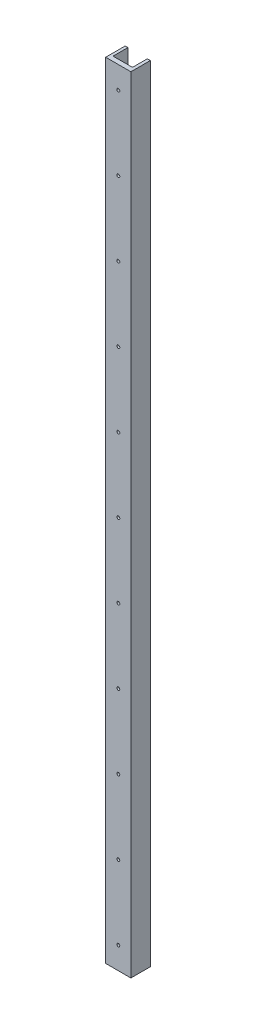
ISO-10303-21;
HEADER;
FILE_DESCRIPTION(('STEP AP214'),'2;1');
FILE_NAME('part.step','',(''),(''),'','','');
FILE_SCHEMA(('AUTOMOTIVE_DESIGN { 1 0 10303 214 1 1 1 1 }'));
ENDSEC;
DATA;
#1=APPLICATION_CONTEXT('core data for automotive mechanical design processes');
#2=APPLICATION_PROTOCOL_DEFINITION('international standard','automotive_design',2000,#1);
#3=PRODUCT_CONTEXT('',#1,'mechanical');
#4=PRODUCT('Part','Part','',(#3));
#5=PRODUCT_RELATED_PRODUCT_CATEGORY('part','',(#4));
#6=PRODUCT_DEFINITION_FORMATION('','',#4);
#7=PRODUCT_DEFINITION_CONTEXT('part definition',#1,'design');
#8=PRODUCT_DEFINITION('design','',#6,#7);
#9=PRODUCT_DEFINITION_SHAPE('','',#8);
#10=(LENGTH_UNIT() NAMED_UNIT(*) SI_UNIT(.MILLI.,.METRE.));
#11=(NAMED_UNIT(*) PLANE_ANGLE_UNIT() SI_UNIT($,.RADIAN.));
#12=(NAMED_UNIT(*) SI_UNIT($,.STERADIAN.) SOLID_ANGLE_UNIT());
#13=UNCERTAINTY_MEASURE_WITH_UNIT(LENGTH_MEASURE(1.E-05),#10,'distance_accuracy_value','');
#14=(GEOMETRIC_REPRESENTATION_CONTEXT(3) GLOBAL_UNCERTAINTY_ASSIGNED_CONTEXT((#13)) GLOBAL_UNIT_ASSIGNED_CONTEXT((#10,
#11,#12)) REPRESENTATION_CONTEXT('',''));
#15=CARTESIAN_POINT('',(0.,0.,0.));
#16=DIRECTION('',(0.,0.,1.));
#17=DIRECTION('',(1.,0.,0.));
#18=AXIS2_PLACEMENT_3D('',#15,#16,#17);
#19=CARTESIAN_POINT('',(0.,0.,0.));
#20=DIRECTION('',(0.,0.,-1.));
#21=DIRECTION('',(-1.,0.,0.));
#22=AXIS2_PLACEMENT_3D('',#19,#20,#21);
#23=PLANE('',#22);
#24=DIRECTION('',(1.,0.,0.));
#25=VECTOR('',#24,1.);
#26=CARTESIAN_POINT('',(-43.18,-1221.28003368592,0.));
#27=LINE('',#26,#25);
#28=CARTESIAN_POINT('',(-5.1435,-1221.28003368592,0.));
#29=VERTEX_POINT('',#28);
#30=CARTESIAN_POINT('',(0.,-1221.28003368592,0.));
#31=VERTEX_POINT('',#30);
#32=EDGE_CURVE('E153',#29,#31,#27,.T.);
#33=ORIENTED_EDGE('',*,*,#32,.F.);
#34=DIRECTION('',(0.,1.,0.));
#35=VECTOR('',#34,1.);
#36=CARTESIAN_POINT('',(-5.1435,0.,0.));
#37=LINE('',#36,#35);
#38=CARTESIAN_POINT('',(-5.1435,124.919966314081,0.));
#39=VERTEX_POINT('',#38);
#40=EDGE_CURVE('E42',#29,#39,#37,.T.);
#41=ORIENTED_EDGE('',*,*,#40,.T.);
#42=DIRECTION('',(-1.,0.,0.));
#43=VECTOR('',#42,1.);
#44=CARTESIAN_POINT('',(-43.18,124.919966314081,0.));
#45=LINE('',#44,#43);
#46=CARTESIAN_POINT('',(0.,124.919966314081,0.));
#47=VERTEX_POINT('',#46);
#48=EDGE_CURVE('E145',#47,#39,#45,.T.);
#49=ORIENTED_EDGE('',*,*,#48,.F.);
#50=DIRECTION('',(0.,1.,0.));
#51=VECTOR('',#50,1.);
#52=CARTESIAN_POINT('',(0.,-1221.28003368592,0.));
#53=LINE('',#52,#51);
#54=EDGE_CURVE('E155',#31,#47,#53,.T.);
#55=ORIENTED_EDGE('',*,*,#54,.F.);
#56=EDGE_LOOP('',(#33,#41,#49,#55));
#57=FACE_BOUND('',#56,.T.);
#58=ADVANCED_FACE('F33',(#57),#23,.T.);
#59=CARTESIAN_POINT('',(-43.18,-1221.28003368592,33.3248));
#60=DIRECTION('',(1.,0.,0.));
#61=DIRECTION('',(0.,0.,-1.));
#62=AXIS2_PLACEMENT_3D('',#59,#60,#61);
#63=PLANE('',#62);
#64=DIRECTION('',(0.,-1.,0.));
#65=VECTOR('',#64,1.);
#66=CARTESIAN_POINT('',(-43.18,-1221.28003368592,0.));
#67=LINE('',#66,#65);
#68=CARTESIAN_POINT('',(-43.18,124.919966314081,0.));
#69=VERTEX_POINT('',#68);
#70=CARTESIAN_POINT('',(-43.18,-1221.28003368592,0.));
#71=VERTEX_POINT('',#70);
#72=EDGE_CURVE('E141',#69,#71,#67,.T.);
#73=ORIENTED_EDGE('',*,*,#72,.T.);
#74=DIRECTION('',(0.,0.,-1.));
#75=VECTOR('',#74,1.);
#76=CARTESIAN_POINT('',(-43.18,-1221.28003368592,33.3248));
#77=LINE('',#76,#75);
#78=CARTESIAN_POINT('',(-43.18,-1221.28003368592,33.3248));
#79=VERTEX_POINT('',#78);
#80=EDGE_CURVE('E166',#79,#71,#77,.T.);
#81=ORIENTED_EDGE('',*,*,#80,.F.);
#82=DIRECTION('',(0.,-1.,0.));
#83=VECTOR('',#82,1.);
#84=CARTESIAN_POINT('',(-43.18,-1221.28003368592,33.3248));
#85=LINE('',#84,#83);
#86=CARTESIAN_POINT('',(-43.18,124.919966314081,33.3248));
#87=VERTEX_POINT('',#86);
#88=EDGE_CURVE('E143',#87,#79,#85,.T.);
#89=ORIENTED_EDGE('',*,*,#88,.F.);
#90=DIRECTION('',(0.,0.,-1.));
#91=VECTOR('',#90,1.);
#92=CARTESIAN_POINT('',(-43.18,124.919966314081,33.3248));
#93=LINE('',#92,#91);
#94=EDGE_CURVE('E150',#87,#69,#93,.T.);
#95=ORIENTED_EDGE('',*,*,#94,.T.);
#96=EDGE_LOOP('',(#73,#81,#89,#95));
#97=FACE_BOUND('',#96,.T.);
#98=ADVANCED_FACE('F35',(#97),#63,.F.);
#99=CARTESIAN_POINT('',(-43.18,-1221.28003368592,33.3248));
#100=DIRECTION('',(0.,1.,0.));
#101=DIRECTION('',(0.,0.,1.));
#102=AXIS2_PLACEMENT_3D('',#99,#100,#101);
#103=PLANE('',#102);
#104=CARTESIAN_POINT('',(-38.481,-1221.28003368592,0.));
#105=VERTEX_POINT('',#104);
#106=EDGE_CURVE('E129',#71,#105,#27,.T.);
#107=ORIENTED_EDGE('',*,*,#106,.T.);
#108=DIRECTION('',(0.,0.,1.));
#109=VECTOR('',#108,1.);
#110=CARTESIAN_POINT('',(-38.481,-1221.28003368592,-7.73428244373345));
#111=LINE('',#110,#109);
#112=CARTESIAN_POINT('',(-38.481,-1221.28003368592,25.3873));
#113=VERTEX_POINT('',#112);
#114=EDGE_CURVE('E112',#105,#113,#111,.T.);
#115=ORIENTED_EDGE('',*,*,#114,.T.);
#116=DIRECTION('',(1.,0.,0.));
#117=VECTOR('',#116,1.);
#118=CARTESIAN_POINT('',(-38.481,-1221.28003368592,25.3873));
#119=LINE('',#118,#117);
#120=CARTESIAN_POINT('',(-5.1435,-1221.28003368592,25.3873));
#121=VERTEX_POINT('',#120);
#122=EDGE_CURVE('E123',#113,#121,#119,.T.);
#123=ORIENTED_EDGE('',*,*,#122,.T.);
#124=DIRECTION('',(0.,0.,1.));
#125=VECTOR('',#124,1.);
#126=CARTESIAN_POINT('',(-5.1435,-1221.28003368592,-7.73428244373345));
#127=LINE('',#126,#125);
#128=EDGE_CURVE('E119',#29,#121,#127,.T.);
#129=ORIENTED_EDGE('',*,*,#128,.F.);
#130=ORIENTED_EDGE('',*,*,#32,.T.);
#131=DIRECTION('',(0.,0.,-1.));
#132=VECTOR('',#131,1.);
#133=CARTESIAN_POINT('',(0.,-1221.28003368592,33.3248));
#134=LINE('',#133,#132);
#135=CARTESIAN_POINT('',(0.,-1221.28003368592,33.3248));
#136=VERTEX_POINT('',#135);
#137=EDGE_CURVE('E163',#136,#31,#134,.T.);
#138=ORIENTED_EDGE('',*,*,#137,.F.);
#139=DIRECTION('',(1.,0.,0.));
#140=VECTOR('',#139,1.);
#141=CARTESIAN_POINT('',(-43.18,-1221.28003368592,33.3248));
#142=LINE('',#141,#140);
#143=EDGE_CURVE('E88',#79,#136,#142,.T.);
#144=ORIENTED_EDGE('',*,*,#143,.F.);
#145=ORIENTED_EDGE('',*,*,#80,.T.);
#146=EDGE_LOOP('',(#107,#115,#123,#129,#130,#138,#144,#145));
#147=FACE_BOUND('',#146,.T.);
#148=ADVANCED_FACE('F128',(#147),#103,.F.);
#149=CARTESIAN_POINT('',(0.,-1221.28003368592,33.3248));
#150=DIRECTION('',(-1.,0.,0.));
#151=DIRECTION('',(0.,0.,1.));
#152=AXIS2_PLACEMENT_3D('',#149,#150,#151);
#153=PLANE('',#152);
#154=ORIENTED_EDGE('',*,*,#54,.T.);
#155=DIRECTION('',(0.,0.,-1.));
#156=VECTOR('',#155,1.);
#157=CARTESIAN_POINT('',(0.,124.919966314081,33.3248));
#158=LINE('',#157,#156);
#159=CARTESIAN_POINT('',(0.,124.919966314081,33.3248));
#160=VERTEX_POINT('',#159);
#161=EDGE_CURVE('E160',#160,#47,#158,.T.);
#162=ORIENTED_EDGE('',*,*,#161,.F.);
#163=DIRECTION('',(0.,1.,0.));
#164=VECTOR('',#163,1.);
#165=CARTESIAN_POINT('',(0.,-1221.28003368592,33.3248));
#166=LINE('',#165,#164);
#167=EDGE_CURVE('E147',#136,#160,#166,.T.);
#168=ORIENTED_EDGE('',*,*,#167,.F.);
#169=ORIENTED_EDGE('',*,*,#137,.T.);
#170=EDGE_LOOP('',(#154,#162,#168,#169));
#171=FACE_BOUND('',#170,.T.);
#172=ADVANCED_FACE('F305',(#171),#153,.F.);
#173=CARTESIAN_POINT('',(-43.18,124.919966314081,33.3248));
#174=DIRECTION('',(0.,-1.,0.));
#175=DIRECTION('',(0.,0.,-1.));
#176=AXIS2_PLACEMENT_3D('',#173,#174,#175);
#177=PLANE('',#176);
#178=DIRECTION('',(1.,0.,0.));
#179=VECTOR('',#178,1.);
#180=CARTESIAN_POINT('',(-38.481,124.919966314081,25.3873));
#181=LINE('',#180,#179);
#182=CARTESIAN_POINT('',(-38.481,124.919966314081,25.3873));
#183=VERTEX_POINT('',#182);
#184=CARTESIAN_POINT('',(-5.1435,124.919966314081,25.3873));
#185=VERTEX_POINT('',#184);
#186=EDGE_CURVE('E131',#183,#185,#181,.T.);
#187=ORIENTED_EDGE('',*,*,#186,.F.);
#188=DIRECTION('',(0.,0.,1.));
#189=VECTOR('',#188,1.);
#190=CARTESIAN_POINT('',(-38.481,124.919966314081,-7.73428244373345));
#191=LINE('',#190,#189);
#192=CARTESIAN_POINT('',(-38.481,124.919966314081,0.));
#193=VERTEX_POINT('',#192);
#194=EDGE_CURVE('E114',#193,#183,#191,.T.);
#195=ORIENTED_EDGE('',*,*,#194,.F.);
#196=EDGE_CURVE('E80',#193,#69,#45,.T.);
#197=ORIENTED_EDGE('',*,*,#196,.T.);
#198=ORIENTED_EDGE('',*,*,#94,.F.);
#199=DIRECTION('',(-1.,0.,0.));
#200=VECTOR('',#199,1.);
#201=CARTESIAN_POINT('',(-43.18,124.919966314081,33.3248));
#202=LINE('',#201,#200);
#203=EDGE_CURVE('E59',#160,#87,#202,.T.);
#204=ORIENTED_EDGE('',*,*,#203,.F.);
#205=ORIENTED_EDGE('',*,*,#161,.T.);
#206=ORIENTED_EDGE('',*,*,#48,.T.);
#207=DIRECTION('',(0.,0.,1.));
#208=VECTOR('',#207,1.);
#209=CARTESIAN_POINT('',(-5.1435,124.919966314081,-7.73428244373345));
#210=LINE('',#209,#208);
#211=EDGE_CURVE('E50',#39,#185,#210,.T.);
#212=ORIENTED_EDGE('',*,*,#211,.T.);
#213=EDGE_LOOP('',(#187,#195,#197,#198,#204,#205,#206,#212));
#214=FACE_BOUND('',#213,.T.);
#215=ADVANCED_FACE('F297',(#214),#177,.F.);
#216=CARTESIAN_POINT('',(0.,0.,33.3248));
#217=DIRECTION('',(0.,0.,-1.));
#218=DIRECTION('',(-1.,0.,0.));
#219=AXIS2_PLACEMENT_3D('',#216,#217,#218);
#220=PLANE('',#219);
#221=CARTESIAN_POINT('',(-21.59,-1183.18003368592,33.3248));
#222=DIRECTION('',(0.,0.,-1.));
#223=DIRECTION('',(-1.,0.,0.));
#224=AXIS2_PLACEMENT_3D('',#221,#222,#223);
#225=CIRCLE('',#224,2.55269999999998);
#226=CARTESIAN_POINT('',(-24.1427,-1183.18003368592,33.3248));
#227=VERTEX_POINT('',#226);
#228=EDGE_CURVE('E37',#227,#227,#225,.T.);
#229=ORIENTED_EDGE('',*,*,#228,.T.);
#230=EDGE_LOOP('',(#229));
#231=FACE_BOUND('',#230,.T.);
#232=CARTESIAN_POINT('',(-21.5900000000004,-1056.18003368592,33.3248));
#233=DIRECTION('',(0.,0.,-1.));
#234=DIRECTION('',(-1.,0.,0.));
#235=AXIS2_PLACEMENT_3D('',#232,#233,#234);
#236=CIRCLE('',#235,2.55269999999998);
#237=CARTESIAN_POINT('',(-24.1427000000004,-1056.18003368592,33.3248));
#238=VERTEX_POINT('',#237);
#239=EDGE_CURVE('E210',#238,#238,#236,.T.);
#240=ORIENTED_EDGE('',*,*,#239,.T.);
#241=EDGE_LOOP('',(#240));
#242=FACE_BOUND('',#241,.T.);
#243=CARTESIAN_POINT('',(-21.5900000000009,-929.180033685919,33.3248));
#244=DIRECTION('',(0.,0.,-1.));
#245=DIRECTION('',(-1.,0.,0.));
#246=AXIS2_PLACEMENT_3D('',#243,#244,#245);
#247=CIRCLE('',#246,2.55269999999998);
#248=CARTESIAN_POINT('',(-24.1427000000009,-929.180033685919,33.3248));
#249=VERTEX_POINT('',#248);
#250=EDGE_CURVE('E206',#249,#249,#247,.T.);
#251=ORIENTED_EDGE('',*,*,#250,.T.);
#252=EDGE_LOOP('',(#251));
#253=FACE_BOUND('',#252,.T.);
#254=CARTESIAN_POINT('',(-21.5900000000013,-802.180033685919,33.3248));
#255=DIRECTION('',(0.,0.,-1.));
#256=DIRECTION('',(-1.,0.,0.));
#257=AXIS2_PLACEMENT_3D('',#254,#255,#256);
#258=CIRCLE('',#257,2.55269999999998);
#259=CARTESIAN_POINT('',(-24.1427000000013,-802.180033685919,33.3248));
#260=VERTEX_POINT('',#259);
#261=EDGE_CURVE('E201',#260,#260,#258,.T.);
#262=ORIENTED_EDGE('',*,*,#261,.T.);
#263=EDGE_LOOP('',(#262));
#264=FACE_BOUND('',#263,.T.);
#265=CARTESIAN_POINT('',(-21.5900000000018,-675.180033685919,33.3248));
#266=DIRECTION('',(0.,0.,-1.));
#267=DIRECTION('',(-1.,0.,0.));
#268=AXIS2_PLACEMENT_3D('',#265,#266,#267);
#269=CIRCLE('',#268,2.55269999999998);
#270=CARTESIAN_POINT('',(-24.1427000000018,-675.180033685919,33.3248));
#271=VERTEX_POINT('',#270);
#272=EDGE_CURVE('E196',#271,#271,#269,.T.);
#273=ORIENTED_EDGE('',*,*,#272,.T.);
#274=EDGE_LOOP('',(#273));
#275=FACE_BOUND('',#274,.T.);
#276=CARTESIAN_POINT('',(-21.5900000000022,-548.180033685919,33.3248));
#277=DIRECTION('',(0.,0.,-1.));
#278=DIRECTION('',(-1.,0.,0.));
#279=AXIS2_PLACEMENT_3D('',#276,#277,#278);
#280=CIRCLE('',#279,2.55269999999998);
#281=CARTESIAN_POINT('',(-24.1427000000022,-548.180033685919,33.3248));
#282=VERTEX_POINT('',#281);
#283=EDGE_CURVE('E191',#282,#282,#280,.T.);
#284=ORIENTED_EDGE('',*,*,#283,.T.);
#285=EDGE_LOOP('',(#284));
#286=FACE_BOUND('',#285,.T.);
#287=CARTESIAN_POINT('',(-21.5900000000027,-421.180033685919,33.3248));
#288=DIRECTION('',(0.,0.,-1.));
#289=DIRECTION('',(-1.,0.,0.));
#290=AXIS2_PLACEMENT_3D('',#287,#288,#289);
#291=CIRCLE('',#290,2.55269999999998);
#292=CARTESIAN_POINT('',(-24.1427000000026,-421.180033685919,33.3248));
#293=VERTEX_POINT('',#292);
#294=EDGE_CURVE('E186',#293,#293,#291,.T.);
#295=ORIENTED_EDGE('',*,*,#294,.T.);
#296=EDGE_LOOP('',(#295));
#297=FACE_BOUND('',#296,.T.);
#298=CARTESIAN_POINT('',(-21.5900000000031,-294.180033685919,33.3248));
#299=DIRECTION('',(0.,0.,-1.));
#300=DIRECTION('',(-1.,0.,0.));
#301=AXIS2_PLACEMENT_3D('',#298,#299,#300);
#302=CIRCLE('',#301,2.55269999999998);
#303=CARTESIAN_POINT('',(-24.1427000000031,-294.180033685919,33.3248));
#304=VERTEX_POINT('',#303);
#305=EDGE_CURVE('E181',#304,#304,#302,.T.);
#306=ORIENTED_EDGE('',*,*,#305,.T.);
#307=EDGE_LOOP('',(#306));
#308=FACE_BOUND('',#307,.T.);
#309=CARTESIAN_POINT('',(-21.5900000000035,-167.180033685919,33.3248));
#310=DIRECTION('',(0.,0.,-1.));
#311=DIRECTION('',(-1.,0.,0.));
#312=AXIS2_PLACEMENT_3D('',#309,#310,#311);
#313=CIRCLE('',#312,2.55269999999998);
#314=CARTESIAN_POINT('',(-24.1427000000035,-167.180033685919,33.3248));
#315=VERTEX_POINT('',#314);
#316=EDGE_CURVE('E176',#315,#315,#313,.T.);
#317=ORIENTED_EDGE('',*,*,#316,.T.);
#318=EDGE_LOOP('',(#317));
#319=FACE_BOUND('',#318,.T.);
#320=CARTESIAN_POINT('',(-21.590000000004,-40.1800336859193,33.3248));
#321=DIRECTION('',(0.,0.,-1.));
#322=DIRECTION('',(-1.,0.,0.));
#323=AXIS2_PLACEMENT_3D('',#320,#321,#322);
#324=CIRCLE('',#323,2.55269999999998);
#325=CARTESIAN_POINT('',(-24.142700000004,-40.1800336859193,33.3248));
#326=VERTEX_POINT('',#325);
#327=EDGE_CURVE('E171',#326,#326,#324,.T.);
#328=ORIENTED_EDGE('',*,*,#327,.T.);
#329=EDGE_LOOP('',(#328));
#330=FACE_BOUND('',#329,.T.);
#331=CARTESIAN_POINT('',(-21.5900000000044,86.8199663140807,33.3248));
#332=DIRECTION('',(0.,0.,-1.));
#333=DIRECTION('',(-1.,0.,0.));
#334=AXIS2_PLACEMENT_3D('',#331,#332,#333);
#335=CIRCLE('',#334,2.55269999999998);
#336=CARTESIAN_POINT('',(-24.1427000000044,86.8199663140807,33.3248));
#337=VERTEX_POINT('',#336);
#338=EDGE_CURVE('E139',#337,#337,#335,.T.);
#339=ORIENTED_EDGE('',*,*,#338,.T.);
#340=EDGE_LOOP('',(#339));
#341=FACE_BOUND('',#340,.T.);
#342=ORIENTED_EDGE('',*,*,#88,.T.);
#343=ORIENTED_EDGE('',*,*,#143,.T.);
#344=ORIENTED_EDGE('',*,*,#167,.T.);
#345=ORIENTED_EDGE('',*,*,#203,.T.);
#346=EDGE_LOOP('',(#342,#343,#344,#345));
#347=FACE_BOUND('',#346,.T.);
#348=ADVANCED_FACE('F289',(#231,#242,#253,#264,#275,#286,#297,#308,#319,#330,#341,#347),#220,.F.);
#349=DIRECTION('',(0.,1.,0.));
#350=VECTOR('',#349,1.);
#351=CARTESIAN_POINT('',(-38.481,0.,0.));
#352=LINE('',#351,#350);
#353=EDGE_CURVE('E11',#105,#193,#352,.T.);
#354=ORIENTED_EDGE('',*,*,#353,.F.);
#355=ORIENTED_EDGE('',*,*,#106,.F.);
#356=ORIENTED_EDGE('',*,*,#72,.F.);
#357=ORIENTED_EDGE('',*,*,#196,.F.);
#358=EDGE_LOOP('',(#354,#355,#356,#357));
#359=FACE_BOUND('',#358,.T.);
#360=ADVANCED_FACE('F280',(#359),#23,.T.);
#361=CARTESIAN_POINT('',(-38.481,-1221.28003368592,-7.73428244373345));
#362=DIRECTION('',(-1.,0.,0.));
#363=DIRECTION('',(0.,0.,1.));
#364=AXIS2_PLACEMENT_3D('',#361,#362,#363);
#365=PLANE('',#364);
#366=ORIENTED_EDGE('',*,*,#353,.T.);
#367=ORIENTED_EDGE('',*,*,#194,.T.);
#368=DIRECTION('',(0.,1.,0.));
#369=VECTOR('',#368,1.);
#370=CARTESIAN_POINT('',(-38.481,-1221.28003368592,25.3873));
#371=LINE('',#370,#369);
#372=EDGE_CURVE('E108',#113,#183,#371,.T.);
#373=ORIENTED_EDGE('',*,*,#372,.F.);
#374=ORIENTED_EDGE('',*,*,#114,.F.);
#375=EDGE_LOOP('',(#366,#367,#373,#374));
#376=FACE_BOUND('',#375,.T.);
#377=ADVANCED_FACE('F110',(#376),#365,.F.);
#378=CARTESIAN_POINT('',(-5.1435,-1221.28003368592,-7.73428244373345));
#379=DIRECTION('',(-1.,0.,0.));
#380=DIRECTION('',(0.,0.,1.));
#381=AXIS2_PLACEMENT_3D('',#378,#379,#380);
#382=PLANE('',#381);
#383=ORIENTED_EDGE('',*,*,#128,.T.);
#384=DIRECTION('',(0.,1.,0.));
#385=VECTOR('',#384,1.);
#386=CARTESIAN_POINT('',(-5.1435,-1221.28003368592,25.3873));
#387=LINE('',#386,#385);
#388=EDGE_CURVE('E118',#121,#185,#387,.T.);
#389=ORIENTED_EDGE('',*,*,#388,.T.);
#390=ORIENTED_EDGE('',*,*,#211,.F.);
#391=ORIENTED_EDGE('',*,*,#40,.F.);
#392=EDGE_LOOP('',(#383,#389,#390,#391));
#393=FACE_BOUND('',#392,.T.);
#394=ADVANCED_FACE('F295',(#393),#382,.T.);
#395=CARTESIAN_POINT('',(-38.481,-1221.28003368592,25.3873));
#396=DIRECTION('',(0.,0.,1.));
#397=DIRECTION('',(1.,0.,0.));
#398=AXIS2_PLACEMENT_3D('',#395,#396,#397);
#399=PLANE('',#398);
#400=CARTESIAN_POINT('',(-21.59,-1183.18003368592,25.3873));
#401=DIRECTION('',(0.,0.,-1.));
#402=DIRECTION('',(-1.,0.,0.));
#403=AXIS2_PLACEMENT_3D('',#400,#401,#402);
#404=CIRCLE('',#403,5.1103022);
#405=CARTESIAN_POINT('',(-26.7003022,-1183.18003368592,25.3873));
#406=VERTEX_POINT('',#405);
#407=EDGE_CURVE('E568',#406,#406,#404,.T.);
#408=ORIENTED_EDGE('',*,*,#407,.F.);
#409=EDGE_LOOP('',(#408));
#410=FACE_BOUND('',#409,.T.);
#411=CARTESIAN_POINT('',(-21.5900000000004,-1056.18003368592,25.3873));
#412=DIRECTION('',(0.,0.,-1.));
#413=DIRECTION('',(-1.,0.,0.));
#414=AXIS2_PLACEMENT_3D('',#411,#412,#413);
#415=CIRCLE('',#414,5.1103022);
#416=CARTESIAN_POINT('',(-26.7003022000004,-1056.18003368592,25.3873));
#417=VERTEX_POINT('',#416);
#418=EDGE_CURVE('E219',#417,#417,#415,.T.);
#419=ORIENTED_EDGE('',*,*,#418,.F.);
#420=EDGE_LOOP('',(#419));
#421=FACE_BOUND('',#420,.T.);
#422=CARTESIAN_POINT('',(-21.5900000000009,-929.180033685919,25.3873));
#423=DIRECTION('',(0.,0.,-1.));
#424=DIRECTION('',(-1.,0.,0.));
#425=AXIS2_PLACEMENT_3D('',#422,#423,#424);
#426=CIRCLE('',#425,5.1103022);
#427=CARTESIAN_POINT('',(-26.7003022000009,-929.180033685919,25.3873));
#428=VERTEX_POINT('',#427);
#429=EDGE_CURVE('E212',#428,#428,#426,.T.);
#430=ORIENTED_EDGE('',*,*,#429,.F.);
#431=EDGE_LOOP('',(#430));
#432=FACE_BOUND('',#431,.T.);
#433=CARTESIAN_POINT('',(-21.5900000000013,-802.180033685919,25.3873));
#434=DIRECTION('',(0.,0.,-1.));
#435=DIRECTION('',(-1.,0.,0.));
#436=AXIS2_PLACEMENT_3D('',#433,#434,#435);
#437=CIRCLE('',#436,5.1103022);
#438=CARTESIAN_POINT('',(-26.7003022000013,-802.180033685919,25.3873));
#439=VERTEX_POINT('',#438);
#440=EDGE_CURVE('E208',#439,#439,#437,.T.);
#441=ORIENTED_EDGE('',*,*,#440,.F.);
#442=EDGE_LOOP('',(#441));
#443=FACE_BOUND('',#442,.T.);
#444=CARTESIAN_POINT('',(-21.5900000000018,-675.180033685919,25.3873));
#445=DIRECTION('',(0.,0.,-1.));
#446=DIRECTION('',(-1.,0.,0.));
#447=AXIS2_PLACEMENT_3D('',#444,#445,#446);
#448=CIRCLE('',#447,5.1103022);
#449=CARTESIAN_POINT('',(-26.7003022000018,-675.180033685919,25.3873));
#450=VERTEX_POINT('',#449);
#451=EDGE_CURVE('E204',#450,#450,#448,.T.);
#452=ORIENTED_EDGE('',*,*,#451,.F.);
#453=EDGE_LOOP('',(#452));
#454=FACE_BOUND('',#453,.T.);
#455=CARTESIAN_POINT('',(-21.5900000000022,-548.180033685919,25.3873));
#456=DIRECTION('',(0.,0.,-1.));
#457=DIRECTION('',(-1.,0.,0.));
#458=AXIS2_PLACEMENT_3D('',#455,#456,#457);
#459=CIRCLE('',#458,5.1103022);
#460=CARTESIAN_POINT('',(-26.7003022000022,-548.180033685919,25.3873));
#461=VERTEX_POINT('',#460);
#462=EDGE_CURVE('E199',#461,#461,#459,.T.);
#463=ORIENTED_EDGE('',*,*,#462,.F.);
#464=EDGE_LOOP('',(#463));
#465=FACE_BOUND('',#464,.T.);
#466=CARTESIAN_POINT('',(-21.5900000000027,-421.180033685919,25.3873));
#467=DIRECTION('',(0.,0.,-1.));
#468=DIRECTION('',(-1.,0.,0.));
#469=AXIS2_PLACEMENT_3D('',#466,#467,#468);
#470=CIRCLE('',#469,5.1103022);
#471=CARTESIAN_POINT('',(-26.7003022000027,-421.180033685919,25.3873));
#472=VERTEX_POINT('',#471);
#473=EDGE_CURVE('E194',#472,#472,#470,.T.);
#474=ORIENTED_EDGE('',*,*,#473,.F.);
#475=EDGE_LOOP('',(#474));
#476=FACE_BOUND('',#475,.T.);
#477=CARTESIAN_POINT('',(-21.5900000000031,-294.180033685919,25.3873));
#478=DIRECTION('',(0.,0.,-1.));
#479=DIRECTION('',(-1.,0.,0.));
#480=AXIS2_PLACEMENT_3D('',#477,#478,#479);
#481=CIRCLE('',#480,5.1103022);
#482=CARTESIAN_POINT('',(-26.7003022000031,-294.180033685919,25.3873));
#483=VERTEX_POINT('',#482);
#484=EDGE_CURVE('E189',#483,#483,#481,.T.);
#485=ORIENTED_EDGE('',*,*,#484,.F.);
#486=EDGE_LOOP('',(#485));
#487=FACE_BOUND('',#486,.T.);
#488=CARTESIAN_POINT('',(-21.5900000000035,-167.180033685919,25.3873));
#489=DIRECTION('',(0.,0.,-1.));
#490=DIRECTION('',(-1.,0.,0.));
#491=AXIS2_PLACEMENT_3D('',#488,#489,#490);
#492=CIRCLE('',#491,5.1103022);
#493=CARTESIAN_POINT('',(-26.7003022000035,-167.180033685919,25.3873));
#494=VERTEX_POINT('',#493);
#495=EDGE_CURVE('E184',#494,#494,#492,.T.);
#496=ORIENTED_EDGE('',*,*,#495,.F.);
#497=EDGE_LOOP('',(#496));
#498=FACE_BOUND('',#497,.T.);
#499=CARTESIAN_POINT('',(-21.590000000004,-40.1800336859193,25.3873));
#500=DIRECTION('',(0.,0.,-1.));
#501=DIRECTION('',(-1.,0.,0.));
#502=AXIS2_PLACEMENT_3D('',#499,#500,#501);
#503=CIRCLE('',#502,5.1103022);
#504=CARTESIAN_POINT('',(-26.700302200004,-40.1800336859193,25.3873));
#505=VERTEX_POINT('',#504);
#506=EDGE_CURVE('E179',#505,#505,#503,.T.);
#507=ORIENTED_EDGE('',*,*,#506,.F.);
#508=EDGE_LOOP('',(#507));
#509=FACE_BOUND('',#508,.T.);
#510=CARTESIAN_POINT('',(-21.5900000000044,86.8199663140807,25.3873));
#511=DIRECTION('',(0.,0.,-1.));
#512=DIRECTION('',(-1.,0.,0.));
#513=AXIS2_PLACEMENT_3D('',#510,#511,#512);
#514=CIRCLE('',#513,5.1103022);
#515=CARTESIAN_POINT('',(-26.7003022000044,86.8199663140807,25.3873));
#516=VERTEX_POINT('',#515);
#517=EDGE_CURVE('E174',#516,#516,#514,.T.);
#518=ORIENTED_EDGE('',*,*,#517,.F.);
#519=EDGE_LOOP('',(#518));
#520=FACE_BOUND('',#519,.T.);
#521=ORIENTED_EDGE('',*,*,#186,.T.);
#522=ORIENTED_EDGE('',*,*,#388,.F.);
#523=ORIENTED_EDGE('',*,*,#122,.F.);
#524=ORIENTED_EDGE('',*,*,#372,.T.);
#525=EDGE_LOOP('',(#521,#522,#523,#524));
#526=FACE_BOUND('',#525,.T.);
#527=ADVANCED_FACE('F124',(#410,#421,#432,#443,#454,#465,#476,#487,#498,#509,#520,#526),#399,.F.);
#528=CARTESIAN_POINT('',(-21.5900000000044,86.8199663140807,25.3873));
#529=DIRECTION('',(0.,0.,-1.));
#530=DIRECTION('',(-1.,0.,0.));
#531=AXIS2_PLACEMENT_3D('',#528,#529,#530);
#532=CYLINDRICAL_SURFACE('',#531,2.55269999999998);
#533=CARTESIAN_POINT('',(-21.5900000000044,86.8199663140807,28.329484769119));
#534=DIRECTION('',(0.,0.,-1.));
#535=DIRECTION('',(-1.,0.,0.));
#536=AXIS2_PLACEMENT_3D('',#533,#534,#535);
#537=CIRCLE('',#536,2.55269999999999);
#538=CARTESIAN_POINT('',(-24.1427000000044,86.8199663140807,28.329484769119));
#539=VERTEX_POINT('',#538);
#540=EDGE_CURVE('E134',#539,#539,#537,.T.);
#541=ORIENTED_EDGE('',*,*,#540,.T.);
#542=EDGE_LOOP('',(#541));
#543=FACE_BOUND('',#542,.T.);
#544=ORIENTED_EDGE('',*,*,#338,.F.);
#545=EDGE_LOOP('',(#544));
#546=FACE_BOUND('',#545,.T.);
#547=ADVANCED_FACE('F262',(#543,#546),#532,.F.);
#548=CARTESIAN_POINT('',(-21.5900000000044,86.8199663140807,25.3873));
#549=DIRECTION('',(0.,0.,-1.));
#550=DIRECTION('',(-1.,0.,0.));
#551=AXIS2_PLACEMENT_3D('',#548,#549,#550);
#552=CONICAL_SURFACE('',#551,5.1103022,0.715584993317672);
#553=ORIENTED_EDGE('',*,*,#540,.F.);
#554=EDGE_LOOP('',(#553));
#555=FACE_BOUND('',#554,.T.);
#556=ORIENTED_EDGE('',*,*,#517,.T.);
#557=EDGE_LOOP('',(#556));
#558=FACE_BOUND('',#557,.T.);
#559=ADVANCED_FACE('F265',(#555,#558),#552,.F.);
#560=CARTESIAN_POINT('',(-21.590000000004,-40.1800336859193,25.3873));
#561=DIRECTION('',(0.,0.,-1.));
#562=DIRECTION('',(-1.,0.,0.));
#563=AXIS2_PLACEMENT_3D('',#560,#561,#562);
#564=CYLINDRICAL_SURFACE('',#563,2.55269999999998);
#565=CARTESIAN_POINT('',(-21.590000000004,-40.1800336859193,28.329484769119));
#566=DIRECTION('',(0.,0.,-1.));
#567=DIRECTION('',(-1.,0.,0.));
#568=AXIS2_PLACEMENT_3D('',#565,#566,#567);
#569=CIRCLE('',#568,2.55269999999999);
#570=CARTESIAN_POINT('',(-24.142700000004,-40.1800336859193,28.329484769119));
#571=VERTEX_POINT('',#570);
#572=EDGE_CURVE('E175',#571,#571,#569,.T.);
#573=ORIENTED_EDGE('',*,*,#572,.T.);
#574=EDGE_LOOP('',(#573));
#575=FACE_BOUND('',#574,.T.);
#576=ORIENTED_EDGE('',*,*,#327,.F.);
#577=EDGE_LOOP('',(#576));
#578=FACE_BOUND('',#577,.T.);
#579=ADVANCED_FACE('F267',(#575,#578),#564,.F.);
#580=CARTESIAN_POINT('',(-21.590000000004,-40.1800336859193,25.3873));
#581=DIRECTION('',(0.,0.,-1.));
#582=DIRECTION('',(-1.,0.,0.));
#583=AXIS2_PLACEMENT_3D('',#580,#581,#582);
#584=CONICAL_SURFACE('',#583,5.1103022,0.715584993317672);
#585=ORIENTED_EDGE('',*,*,#572,.F.);
#586=EDGE_LOOP('',(#585));
#587=FACE_BOUND('',#586,.T.);
#588=ORIENTED_EDGE('',*,*,#506,.T.);
#589=EDGE_LOOP('',(#588));
#590=FACE_BOUND('',#589,.T.);
#591=ADVANCED_FACE('F273',(#587,#590),#584,.F.);
#592=CARTESIAN_POINT('',(-21.5900000000035,-167.180033685919,25.3873));
#593=DIRECTION('',(0.,0.,-1.));
#594=DIRECTION('',(-1.,0.,0.));
#595=AXIS2_PLACEMENT_3D('',#592,#593,#594);
#596=CYLINDRICAL_SURFACE('',#595,2.55269999999998);
#597=CARTESIAN_POINT('',(-21.5900000000035,-167.180033685919,28.329484769119));
#598=DIRECTION('',(0.,0.,-1.));
#599=DIRECTION('',(-1.,0.,0.));
#600=AXIS2_PLACEMENT_3D('',#597,#598,#599);
#601=CIRCLE('',#600,2.55269999999999);
#602=CARTESIAN_POINT('',(-24.1427000000035,-167.180033685919,28.329484769119));
#603=VERTEX_POINT('',#602);
#604=EDGE_CURVE('E180',#603,#603,#601,.T.);
#605=ORIENTED_EDGE('',*,*,#604,.T.);
#606=EDGE_LOOP('',(#605));
#607=FACE_BOUND('',#606,.T.);
#608=ORIENTED_EDGE('',*,*,#316,.F.);
#609=EDGE_LOOP('',(#608));
#610=FACE_BOUND('',#609,.T.);
#611=ADVANCED_FACE('F379',(#607,#610),#596,.F.);
#612=CARTESIAN_POINT('',(-21.5900000000035,-167.180033685919,25.3873));
#613=DIRECTION('',(0.,0.,-1.));
#614=DIRECTION('',(-1.,0.,0.));
#615=AXIS2_PLACEMENT_3D('',#612,#613,#614);
#616=CONICAL_SURFACE('',#615,5.1103022,0.715584993317672);
#617=ORIENTED_EDGE('',*,*,#604,.F.);
#618=EDGE_LOOP('',(#617));
#619=FACE_BOUND('',#618,.T.);
#620=ORIENTED_EDGE('',*,*,#495,.T.);
#621=EDGE_LOOP('',(#620));
#622=FACE_BOUND('',#621,.T.);
#623=ADVANCED_FACE('F388',(#619,#622),#616,.F.);
#624=CARTESIAN_POINT('',(-21.5900000000031,-294.180033685919,25.3873));
#625=DIRECTION('',(0.,0.,-1.));
#626=DIRECTION('',(-1.,0.,0.));
#627=AXIS2_PLACEMENT_3D('',#624,#625,#626);
#628=CYLINDRICAL_SURFACE('',#627,2.55269999999998);
#629=CARTESIAN_POINT('',(-21.5900000000031,-294.180033685919,28.329484769119));
#630=DIRECTION('',(0.,0.,-1.));
#631=DIRECTION('',(-1.,0.,0.));
#632=AXIS2_PLACEMENT_3D('',#629,#630,#631);
#633=CIRCLE('',#632,2.55269999999999);
#634=CARTESIAN_POINT('',(-24.1427000000031,-294.180033685919,28.329484769119));
#635=VERTEX_POINT('',#634);
#636=EDGE_CURVE('E185',#635,#635,#633,.T.);
#637=ORIENTED_EDGE('',*,*,#636,.T.);
#638=EDGE_LOOP('',(#637));
#639=FACE_BOUND('',#638,.T.);
#640=ORIENTED_EDGE('',*,*,#305,.F.);
#641=EDGE_LOOP('',(#640));
#642=FACE_BOUND('',#641,.T.);
#643=ADVANCED_FACE('F397',(#639,#642),#628,.F.);
#644=CARTESIAN_POINT('',(-21.5900000000031,-294.180033685919,25.3873));
#645=DIRECTION('',(0.,0.,-1.));
#646=DIRECTION('',(-1.,0.,0.));
#647=AXIS2_PLACEMENT_3D('',#644,#645,#646);
#648=CONICAL_SURFACE('',#647,5.1103022,0.715584993317673);
#649=ORIENTED_EDGE('',*,*,#636,.F.);
#650=EDGE_LOOP('',(#649));
#651=FACE_BOUND('',#650,.T.);
#652=ORIENTED_EDGE('',*,*,#484,.T.);
#653=EDGE_LOOP('',(#652));
#654=FACE_BOUND('',#653,.T.);
#655=ADVANCED_FACE('F406',(#651,#654),#648,.F.);
#656=CARTESIAN_POINT('',(-21.5900000000027,-421.180033685919,25.3873));
#657=DIRECTION('',(0.,0.,-1.));
#658=DIRECTION('',(-1.,0.,0.));
#659=AXIS2_PLACEMENT_3D('',#656,#657,#658);
#660=CYLINDRICAL_SURFACE('',#659,2.55269999999998);
#661=CARTESIAN_POINT('',(-21.5900000000027,-421.180033685919,28.329484769119));
#662=DIRECTION('',(0.,0.,-1.));
#663=DIRECTION('',(-1.,0.,0.));
#664=AXIS2_PLACEMENT_3D('',#661,#662,#663);
#665=CIRCLE('',#664,2.55269999999999);
#666=CARTESIAN_POINT('',(-24.1427000000026,-421.180033685919,28.329484769119));
#667=VERTEX_POINT('',#666);
#668=EDGE_CURVE('E190',#667,#667,#665,.T.);
#669=ORIENTED_EDGE('',*,*,#668,.T.);
#670=EDGE_LOOP('',(#669));
#671=FACE_BOUND('',#670,.T.);
#672=ORIENTED_EDGE('',*,*,#294,.F.);
#673=EDGE_LOOP('',(#672));
#674=FACE_BOUND('',#673,.T.);
#675=ADVANCED_FACE('F415',(#671,#674),#660,.F.);
#676=CARTESIAN_POINT('',(-21.5900000000027,-421.180033685919,25.3873));
#677=DIRECTION('',(0.,0.,-1.));
#678=DIRECTION('',(-1.,0.,0.));
#679=AXIS2_PLACEMENT_3D('',#676,#677,#678);
#680=CONICAL_SURFACE('',#679,5.1103022,0.715584993317673);
#681=ORIENTED_EDGE('',*,*,#668,.F.);
#682=EDGE_LOOP('',(#681));
#683=FACE_BOUND('',#682,.T.);
#684=ORIENTED_EDGE('',*,*,#473,.T.);
#685=EDGE_LOOP('',(#684));
#686=FACE_BOUND('',#685,.T.);
#687=ADVANCED_FACE('F424',(#683,#686),#680,.F.);
#688=CARTESIAN_POINT('',(-21.5900000000022,-548.180033685919,25.3873));
#689=DIRECTION('',(0.,0.,-1.));
#690=DIRECTION('',(-1.,0.,0.));
#691=AXIS2_PLACEMENT_3D('',#688,#689,#690);
#692=CYLINDRICAL_SURFACE('',#691,2.55269999999998);
#693=CARTESIAN_POINT('',(-21.5900000000022,-548.180033685919,28.329484769119));
#694=DIRECTION('',(0.,0.,-1.));
#695=DIRECTION('',(-1.,0.,0.));
#696=AXIS2_PLACEMENT_3D('',#693,#694,#695);
#697=CIRCLE('',#696,2.55269999999999);
#698=CARTESIAN_POINT('',(-24.1427000000022,-548.180033685919,28.329484769119));
#699=VERTEX_POINT('',#698);
#700=EDGE_CURVE('E195',#699,#699,#697,.T.);
#701=ORIENTED_EDGE('',*,*,#700,.T.);
#702=EDGE_LOOP('',(#701));
#703=FACE_BOUND('',#702,.T.);
#704=ORIENTED_EDGE('',*,*,#283,.F.);
#705=EDGE_LOOP('',(#704));
#706=FACE_BOUND('',#705,.T.);
#707=ADVANCED_FACE('F433',(#703,#706),#692,.F.);
#708=CARTESIAN_POINT('',(-21.5900000000022,-548.180033685919,25.3873));
#709=DIRECTION('',(0.,0.,-1.));
#710=DIRECTION('',(-1.,0.,0.));
#711=AXIS2_PLACEMENT_3D('',#708,#709,#710);
#712=CONICAL_SURFACE('',#711,5.1103022,0.715584993317673);
#713=ORIENTED_EDGE('',*,*,#700,.F.);
#714=EDGE_LOOP('',(#713));
#715=FACE_BOUND('',#714,.T.);
#716=ORIENTED_EDGE('',*,*,#462,.T.);
#717=EDGE_LOOP('',(#716));
#718=FACE_BOUND('',#717,.T.);
#719=ADVANCED_FACE('F442',(#715,#718),#712,.F.);
#720=CARTESIAN_POINT('',(-21.5900000000018,-675.180033685919,25.3873));
#721=DIRECTION('',(0.,0.,-1.));
#722=DIRECTION('',(-1.,0.,0.));
#723=AXIS2_PLACEMENT_3D('',#720,#721,#722);
#724=CYLINDRICAL_SURFACE('',#723,2.55269999999998);
#725=CARTESIAN_POINT('',(-21.5900000000018,-675.180033685919,28.329484769119));
#726=DIRECTION('',(0.,0.,-1.));
#727=DIRECTION('',(-1.,0.,0.));
#728=AXIS2_PLACEMENT_3D('',#725,#726,#727);
#729=CIRCLE('',#728,2.55269999999999);
#730=CARTESIAN_POINT('',(-24.1427000000018,-675.180033685919,28.329484769119));
#731=VERTEX_POINT('',#730);
#732=EDGE_CURVE('E200',#731,#731,#729,.T.);
#733=ORIENTED_EDGE('',*,*,#732,.T.);
#734=EDGE_LOOP('',(#733));
#735=FACE_BOUND('',#734,.T.);
#736=ORIENTED_EDGE('',*,*,#272,.F.);
#737=EDGE_LOOP('',(#736));
#738=FACE_BOUND('',#737,.T.);
#739=ADVANCED_FACE('F451',(#735,#738),#724,.F.);
#740=CARTESIAN_POINT('',(-21.5900000000018,-675.180033685919,25.3873));
#741=DIRECTION('',(0.,0.,-1.));
#742=DIRECTION('',(-1.,0.,0.));
#743=AXIS2_PLACEMENT_3D('',#740,#741,#742);
#744=CONICAL_SURFACE('',#743,5.1103022,0.715584993317673);
#745=ORIENTED_EDGE('',*,*,#732,.F.);
#746=EDGE_LOOP('',(#745));
#747=FACE_BOUND('',#746,.T.);
#748=ORIENTED_EDGE('',*,*,#451,.T.);
#749=EDGE_LOOP('',(#748));
#750=FACE_BOUND('',#749,.T.);
#751=ADVANCED_FACE('F460',(#747,#750),#744,.F.);
#752=CARTESIAN_POINT('',(-21.5900000000013,-802.180033685919,25.3873));
#753=DIRECTION('',(0.,0.,-1.));
#754=DIRECTION('',(-1.,0.,0.));
#755=AXIS2_PLACEMENT_3D('',#752,#753,#754);
#756=CYLINDRICAL_SURFACE('',#755,2.55269999999998);
#757=CARTESIAN_POINT('',(-21.5900000000013,-802.180033685919,28.329484769119));
#758=DIRECTION('',(0.,0.,-1.));
#759=DIRECTION('',(-1.,0.,0.));
#760=AXIS2_PLACEMENT_3D('',#757,#758,#759);
#761=CIRCLE('',#760,2.55269999999999);
#762=CARTESIAN_POINT('',(-24.1427000000013,-802.180033685919,28.329484769119));
#763=VERTEX_POINT('',#762);
#764=EDGE_CURVE('E205',#763,#763,#761,.T.);
#765=ORIENTED_EDGE('',*,*,#764,.T.);
#766=EDGE_LOOP('',(#765));
#767=FACE_BOUND('',#766,.T.);
#768=ORIENTED_EDGE('',*,*,#261,.F.);
#769=EDGE_LOOP('',(#768));
#770=FACE_BOUND('',#769,.T.);
#771=ADVANCED_FACE('F469',(#767,#770),#756,.F.);
#772=CARTESIAN_POINT('',(-21.5900000000013,-802.180033685919,25.3873));
#773=DIRECTION('',(0.,0.,-1.));
#774=DIRECTION('',(-1.,0.,0.));
#775=AXIS2_PLACEMENT_3D('',#772,#773,#774);
#776=CONICAL_SURFACE('',#775,5.1103022,0.715584993317673);
#777=ORIENTED_EDGE('',*,*,#764,.F.);
#778=EDGE_LOOP('',(#777));
#779=FACE_BOUND('',#778,.T.);
#780=ORIENTED_EDGE('',*,*,#440,.T.);
#781=EDGE_LOOP('',(#780));
#782=FACE_BOUND('',#781,.T.);
#783=ADVANCED_FACE('F478',(#779,#782),#776,.F.);
#784=CARTESIAN_POINT('',(-21.5900000000009,-929.180033685919,25.3873));
#785=DIRECTION('',(0.,0.,-1.));
#786=DIRECTION('',(-1.,0.,0.));
#787=AXIS2_PLACEMENT_3D('',#784,#785,#786);
#788=CYLINDRICAL_SURFACE('',#787,2.55269999999998);
#789=CARTESIAN_POINT('',(-21.5900000000009,-929.180033685919,28.329484769119));
#790=DIRECTION('',(0.,0.,-1.));
#791=DIRECTION('',(-1.,0.,0.));
#792=AXIS2_PLACEMENT_3D('',#789,#790,#791);
#793=CIRCLE('',#792,2.55269999999999);
#794=CARTESIAN_POINT('',(-24.1427000000009,-929.180033685919,28.329484769119));
#795=VERTEX_POINT('',#794);
#796=EDGE_CURVE('E209',#795,#795,#793,.T.);
#797=ORIENTED_EDGE('',*,*,#796,.T.);
#798=EDGE_LOOP('',(#797));
#799=FACE_BOUND('',#798,.T.);
#800=ORIENTED_EDGE('',*,*,#250,.F.);
#801=EDGE_LOOP('',(#800));
#802=FACE_BOUND('',#801,.T.);
#803=ADVANCED_FACE('F487',(#799,#802),#788,.F.);
#804=CARTESIAN_POINT('',(-21.5900000000009,-929.180033685919,25.3873));
#805=DIRECTION('',(0.,0.,-1.));
#806=DIRECTION('',(-1.,0.,0.));
#807=AXIS2_PLACEMENT_3D('',#804,#805,#806);
#808=CONICAL_SURFACE('',#807,5.1103022,0.715584993317672);
#809=ORIENTED_EDGE('',*,*,#796,.F.);
#810=EDGE_LOOP('',(#809));
#811=FACE_BOUND('',#810,.T.);
#812=ORIENTED_EDGE('',*,*,#429,.T.);
#813=EDGE_LOOP('',(#812));
#814=FACE_BOUND('',#813,.T.);
#815=ADVANCED_FACE('F496',(#811,#814),#808,.F.);
#816=CARTESIAN_POINT('',(-21.5900000000004,-1056.18003368592,25.3873));
#817=DIRECTION('',(0.,0.,-1.));
#818=DIRECTION('',(-1.,0.,0.));
#819=AXIS2_PLACEMENT_3D('',#816,#817,#818);
#820=CYLINDRICAL_SURFACE('',#819,2.55269999999998);
#821=CARTESIAN_POINT('',(-21.5900000000004,-1056.18003368592,28.329484769119));
#822=DIRECTION('',(0.,0.,-1.));
#823=DIRECTION('',(-1.,0.,0.));
#824=AXIS2_PLACEMENT_3D('',#821,#822,#823);
#825=CIRCLE('',#824,2.55269999999999);
#826=CARTESIAN_POINT('',(-24.1427000000004,-1056.18003368592,28.329484769119));
#827=VERTEX_POINT('',#826);
#828=EDGE_CURVE('E213',#827,#827,#825,.T.);
#829=ORIENTED_EDGE('',*,*,#828,.T.);
#830=EDGE_LOOP('',(#829));
#831=FACE_BOUND('',#830,.T.);
#832=ORIENTED_EDGE('',*,*,#239,.F.);
#833=EDGE_LOOP('',(#832));
#834=FACE_BOUND('',#833,.T.);
#835=ADVANCED_FACE('F505',(#831,#834),#820,.F.);
#836=CARTESIAN_POINT('',(-21.5900000000004,-1056.18003368592,25.3873));
#837=DIRECTION('',(0.,0.,-1.));
#838=DIRECTION('',(-1.,0.,0.));
#839=AXIS2_PLACEMENT_3D('',#836,#837,#838);
#840=CONICAL_SURFACE('',#839,5.1103022,0.715584993317672);
#841=ORIENTED_EDGE('',*,*,#828,.F.);
#842=EDGE_LOOP('',(#841));
#843=FACE_BOUND('',#842,.T.);
#844=ORIENTED_EDGE('',*,*,#418,.T.);
#845=EDGE_LOOP('',(#844));
#846=FACE_BOUND('',#845,.T.);
#847=ADVANCED_FACE('F514',(#843,#846),#840,.F.);
#848=CARTESIAN_POINT('',(-21.59,-1183.18003368592,25.3873));
#849=DIRECTION('',(0.,0.,-1.));
#850=DIRECTION('',(-1.,0.,0.));
#851=AXIS2_PLACEMENT_3D('',#848,#849,#850);
#852=CYLINDRICAL_SURFACE('',#851,2.55269999999998);
#853=CARTESIAN_POINT('',(-21.59,-1183.18003368592,28.329484769119));
#854=DIRECTION('',(0.,0.,-1.));
#855=DIRECTION('',(-1.,0.,0.));
#856=AXIS2_PLACEMENT_3D('',#853,#854,#855);
#857=CIRCLE('',#856,2.55269999999999);
#858=CARTESIAN_POINT('',(-24.1427,-1183.18003368592,28.329484769119));
#859=VERTEX_POINT('',#858);
#860=EDGE_CURVE('E565',#859,#859,#857,.T.);
#861=ORIENTED_EDGE('',*,*,#860,.T.);
#862=EDGE_LOOP('',(#861));
#863=FACE_BOUND('',#862,.T.);
#864=ORIENTED_EDGE('',*,*,#228,.F.);
#865=EDGE_LOOP('',(#864));
#866=FACE_BOUND('',#865,.T.);
#867=ADVANCED_FACE('F522',(#863,#866),#852,.F.);
#868=CARTESIAN_POINT('',(-21.59,-1183.18003368592,25.3873));
#869=DIRECTION('',(0.,0.,-1.));
#870=DIRECTION('',(-1.,0.,0.));
#871=AXIS2_PLACEMENT_3D('',#868,#869,#870);
#872=CONICAL_SURFACE('',#871,5.1103022,0.715584993317672);
#873=ORIENTED_EDGE('',*,*,#860,.F.);
#874=EDGE_LOOP('',(#873));
#875=FACE_BOUND('',#874,.T.);
#876=ORIENTED_EDGE('',*,*,#407,.T.);
#877=EDGE_LOOP('',(#876));
#878=FACE_BOUND('',#877,.T.);
#879=ADVANCED_FACE('F531',(#875,#878),#872,.F.);
#880=CLOSED_SHELL('',(#58,#98,#148,#172,#215,#348,#360,#377,#394,#527,#547,#559,#579,#591,#611,
#623,#643,#655,#675,#687,#707,#719,#739,#751,#771,#783,#803,#815,#835,#847,#867,#879));
#881=MANIFOLD_SOLID_BREP('B2',#880);
#882=ADVANCED_BREP_SHAPE_REPRESENTATION('',(#18,#881),#14);
#883=SHAPE_DEFINITION_REPRESENTATION(#9,#882);
ENDSEC;
END-ISO-10303-21;
